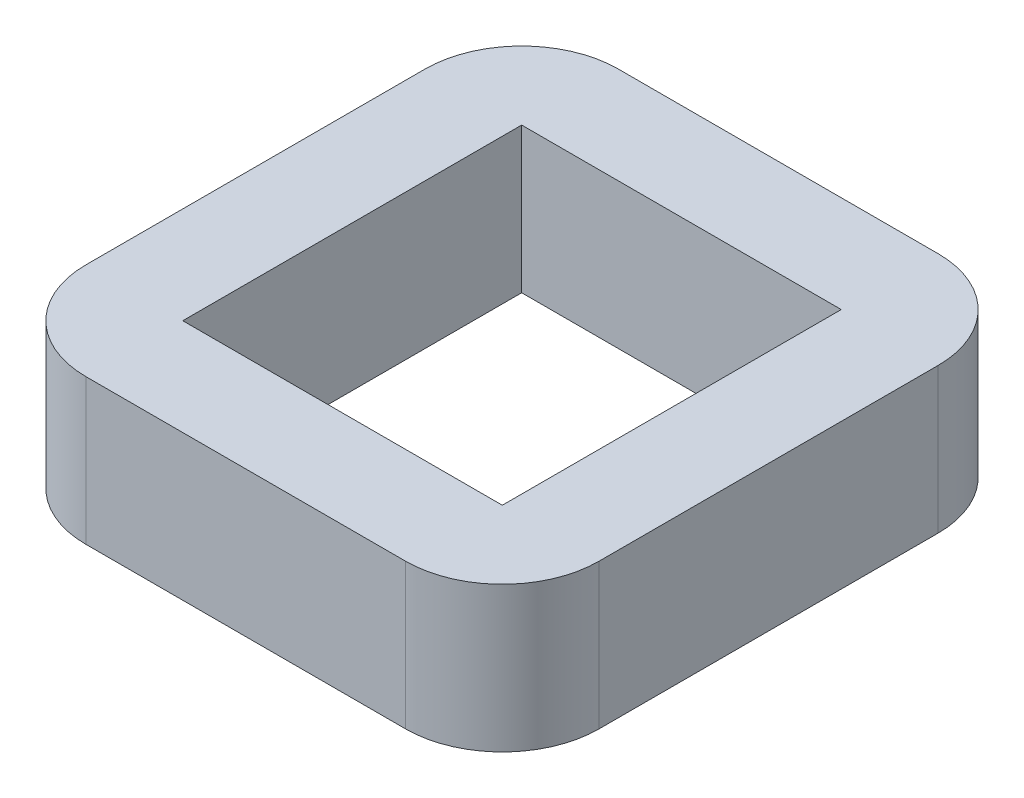
ISO-10303-21;
HEADER;
FILE_DESCRIPTION(('STEP AP214'),'2;1');
FILE_NAME('part.step','',(''),(''),'','','');
FILE_SCHEMA(('AUTOMOTIVE_DESIGN { 1 0 10303 214 1 1 1 1 }'));
ENDSEC;
DATA;
#1=APPLICATION_CONTEXT('core data for automotive mechanical design processes');
#2=APPLICATION_PROTOCOL_DEFINITION('international standard','automotive_design',2000,#1);
#3=PRODUCT_CONTEXT('',#1,'mechanical');
#4=PRODUCT('Part','Part','',(#3));
#5=PRODUCT_RELATED_PRODUCT_CATEGORY('part','',(#4));
#6=PRODUCT_DEFINITION_FORMATION('','',#4);
#7=PRODUCT_DEFINITION_CONTEXT('part definition',#1,'design');
#8=PRODUCT_DEFINITION('design','',#6,#7);
#9=PRODUCT_DEFINITION_SHAPE('','',#8);
#10=(LENGTH_UNIT() NAMED_UNIT(*) SI_UNIT(.MILLI.,.METRE.));
#11=(NAMED_UNIT(*) PLANE_ANGLE_UNIT() SI_UNIT($,.RADIAN.));
#12=(NAMED_UNIT(*) SI_UNIT($,.STERADIAN.) SOLID_ANGLE_UNIT());
#13=UNCERTAINTY_MEASURE_WITH_UNIT(LENGTH_MEASURE(1.E-05),#10,'distance_accuracy_value','');
#14=(GEOMETRIC_REPRESENTATION_CONTEXT(3) GLOBAL_UNCERTAINTY_ASSIGNED_CONTEXT((#13)) GLOBAL_UNIT_ASSIGNED_CONTEXT((#10,
#11,#12)) REPRESENTATION_CONTEXT('',''));
#15=CARTESIAN_POINT('',(0.,0.,0.));
#16=DIRECTION('',(0.,0.,1.));
#17=DIRECTION('',(1.,0.,0.));
#18=AXIS2_PLACEMENT_3D('',#15,#16,#17);
#19=CARTESIAN_POINT('',(-16.5,15.,-17.5));
#20=DIRECTION('',(0.,-1.,0.));
#21=DIRECTION('',(0.,0.,-1.));
#22=AXIS2_PLACEMENT_3D('',#19,#20,#21);
#23=PLANE('',#22);
#24=CARTESIAN_POINT('',(-16.5,15.,-17.5));
#25=DIRECTION('',(0.,1.,0.));
#26=DIRECTION('',(0.,0.,-1.));
#27=AXIS2_PLACEMENT_3D('',#24,#25,#26);
#28=CIRCLE('',#27,9.99999999999997);
#29=CARTESIAN_POINT('',(-16.5,15.,-27.5));
#30=VERTEX_POINT('',#29);
#31=CARTESIAN_POINT('',(-26.5,15.,-17.5));
#32=VERTEX_POINT('',#31);
#33=EDGE_CURVE('E157',#30,#32,#28,.T.);
#34=ORIENTED_EDGE('',*,*,#33,.T.);
#35=DIRECTION('',(0.,0.,1.));
#36=VECTOR('',#35,1.);
#37=CARTESIAN_POINT('',(-26.5,15.,17.5));
#38=LINE('',#37,#36);
#39=CARTESIAN_POINT('',(-26.5,15.,17.5));
#40=VERTEX_POINT('',#39);
#41=EDGE_CURVE('E160',#32,#40,#38,.T.);
#42=ORIENTED_EDGE('',*,*,#41,.T.);
#43=CARTESIAN_POINT('',(-16.5,15.,17.5));
#44=DIRECTION('',(0.,1.,0.));
#45=DIRECTION('',(0.,0.,1.));
#46=AXIS2_PLACEMENT_3D('',#43,#44,#45);
#47=CIRCLE('',#46,9.99999999999999);
#48=CARTESIAN_POINT('',(-16.5,15.,27.5));
#49=VERTEX_POINT('',#48);
#50=EDGE_CURVE('E163',#40,#49,#47,.T.);
#51=ORIENTED_EDGE('',*,*,#50,.T.);
#52=DIRECTION('',(1.,0.,0.));
#53=VECTOR('',#52,1.);
#54=CARTESIAN_POINT('',(16.5,15.,27.5));
#55=LINE('',#54,#53);
#56=CARTESIAN_POINT('',(16.5,15.,27.5));
#57=VERTEX_POINT('',#56);
#58=EDGE_CURVE('E165',#49,#57,#55,.T.);
#59=ORIENTED_EDGE('',*,*,#58,.T.);
#60=CARTESIAN_POINT('',(16.5,15.,17.5));
#61=DIRECTION('',(0.,1.,0.));
#62=DIRECTION('',(0.,0.,1.));
#63=AXIS2_PLACEMENT_3D('',#60,#61,#62);
#64=CIRCLE('',#63,10.);
#65=CARTESIAN_POINT('',(26.5,15.,17.5));
#66=VERTEX_POINT('',#65);
#67=EDGE_CURVE('E167',#57,#66,#64,.T.);
#68=ORIENTED_EDGE('',*,*,#67,.T.);
#69=DIRECTION('',(0.,0.,-1.));
#70=VECTOR('',#69,1.);
#71=CARTESIAN_POINT('',(26.5,15.,17.5));
#72=LINE('',#71,#70);
#73=CARTESIAN_POINT('',(26.5,15.,-17.5));
#74=VERTEX_POINT('',#73);
#75=EDGE_CURVE('E169',#66,#74,#72,.T.);
#76=ORIENTED_EDGE('',*,*,#75,.T.);
#77=CARTESIAN_POINT('',(16.5,15.,-17.5));
#78=DIRECTION('',(0.,1.,0.));
#79=DIRECTION('',(0.,0.,-1.));
#80=AXIS2_PLACEMENT_3D('',#77,#78,#79);
#81=CIRCLE('',#80,9.99999999999999);
#82=CARTESIAN_POINT('',(16.5,15.,-27.5));
#83=VERTEX_POINT('',#82);
#84=EDGE_CURVE('E171',#74,#83,#81,.T.);
#85=ORIENTED_EDGE('',*,*,#84,.T.);
#86=DIRECTION('',(-1.,0.,0.));
#87=VECTOR('',#86,1.);
#88=CARTESIAN_POINT('',(16.5,15.,-27.5));
#89=LINE('',#88,#87);
#90=EDGE_CURVE('E173',#83,#30,#89,.T.);
#91=ORIENTED_EDGE('',*,*,#90,.T.);
#92=EDGE_LOOP('',(#34,#42,#51,#59,#68,#76,#85,#91));
#93=FACE_BOUND('',#92,.T.);
#94=DIRECTION('',(0.,0.,1.));
#95=VECTOR('',#94,1.);
#96=CARTESIAN_POINT('',(-16.5,15.,17.5));
#97=LINE('',#96,#95);
#98=CARTESIAN_POINT('',(-16.5,15.,-17.5));
#99=VERTEX_POINT('',#98);
#100=CARTESIAN_POINT('',(-16.5,15.,17.5));
#101=VERTEX_POINT('',#100);
#102=EDGE_CURVE('E121',#99,#101,#97,.T.);
#103=ORIENTED_EDGE('',*,*,#102,.F.);
#104=DIRECTION('',(-1.,0.,0.));
#105=VECTOR('',#104,1.);
#106=CARTESIAN_POINT('',(16.5,15.,-17.5));
#107=LINE('',#106,#105);
#108=CARTESIAN_POINT('',(16.5,15.,-17.5));
#109=VERTEX_POINT('',#108);
#110=EDGE_CURVE('E143',#109,#99,#107,.T.);
#111=ORIENTED_EDGE('',*,*,#110,.F.);
#112=DIRECTION('',(0.,0.,-1.));
#113=VECTOR('',#112,1.);
#114=CARTESIAN_POINT('',(16.5,15.,17.5));
#115=LINE('',#114,#113);
#116=CARTESIAN_POINT('',(16.5,15.,17.5));
#117=VERTEX_POINT('',#116);
#118=EDGE_CURVE('E141',#117,#109,#115,.T.);
#119=ORIENTED_EDGE('',*,*,#118,.F.);
#120=DIRECTION('',(1.,0.,0.));
#121=VECTOR('',#120,1.);
#122=CARTESIAN_POINT('',(16.5,15.,17.5));
#123=LINE('',#122,#121);
#124=EDGE_CURVE('E129',#101,#117,#123,.T.);
#125=ORIENTED_EDGE('',*,*,#124,.F.);
#126=EDGE_LOOP('',(#103,#111,#119,#125));
#127=FACE_BOUND('',#126,.T.);
#128=ADVANCED_FACE('F32',(#93,#127),#23,.F.);
#129=CARTESIAN_POINT('',(-16.5,0.,-17.5));
#130=DIRECTION('',(0.,-1.,0.));
#131=DIRECTION('',(0.,0.,-1.));
#132=AXIS2_PLACEMENT_3D('',#129,#130,#131);
#133=PLANE('',#132);
#134=CARTESIAN_POINT('',(-16.5,0.,-17.5));
#135=DIRECTION('',(0.,1.,0.));
#136=DIRECTION('',(0.,0.,-1.));
#137=AXIS2_PLACEMENT_3D('',#134,#135,#136);
#138=CIRCLE('',#137,9.99999999999997);
#139=CARTESIAN_POINT('',(-16.5,0.,-27.5));
#140=VERTEX_POINT('',#139);
#141=CARTESIAN_POINT('',(-26.5,0.,-17.5));
#142=VERTEX_POINT('',#141);
#143=EDGE_CURVE('E137',#140,#142,#138,.T.);
#144=ORIENTED_EDGE('',*,*,#143,.F.);
#145=DIRECTION('',(-1.,0.,0.));
#146=VECTOR('',#145,1.);
#147=CARTESIAN_POINT('',(16.5,0.,-27.5));
#148=LINE('',#147,#146);
#149=CARTESIAN_POINT('',(16.5,0.,-27.5));
#150=VERTEX_POINT('',#149);
#151=EDGE_CURVE('E161',#150,#140,#148,.T.);
#152=ORIENTED_EDGE('',*,*,#151,.F.);
#153=CARTESIAN_POINT('',(16.5,0.,-17.5));
#154=DIRECTION('',(0.,1.,0.));
#155=DIRECTION('',(0.,0.,-1.));
#156=AXIS2_PLACEMENT_3D('',#153,#154,#155);
#157=CIRCLE('',#156,9.99999999999999);
#158=CARTESIAN_POINT('',(26.5,0.,-17.5));
#159=VERTEX_POINT('',#158);
#160=EDGE_CURVE('E188',#159,#150,#157,.T.);
#161=ORIENTED_EDGE('',*,*,#160,.F.);
#162=DIRECTION('',(0.,0.,-1.));
#163=VECTOR('',#162,1.);
#164=CARTESIAN_POINT('',(26.5,0.,17.5));
#165=LINE('',#164,#163);
#166=CARTESIAN_POINT('',(26.5,0.,17.5));
#167=VERTEX_POINT('',#166);
#168=EDGE_CURVE('E186',#167,#159,#165,.T.);
#169=ORIENTED_EDGE('',*,*,#168,.F.);
#170=CARTESIAN_POINT('',(16.5,0.,17.5));
#171=DIRECTION('',(0.,1.,0.));
#172=DIRECTION('',(0.,0.,1.));
#173=AXIS2_PLACEMENT_3D('',#170,#171,#172);
#174=CIRCLE('',#173,10.);
#175=CARTESIAN_POINT('',(16.5,0.,27.5));
#176=VERTEX_POINT('',#175);
#177=EDGE_CURVE('E184',#176,#167,#174,.T.);
#178=ORIENTED_EDGE('',*,*,#177,.F.);
#179=DIRECTION('',(1.,0.,0.));
#180=VECTOR('',#179,1.);
#181=CARTESIAN_POINT('',(16.5,0.,27.5));
#182=LINE('',#181,#180);
#183=CARTESIAN_POINT('',(-16.5,0.,27.5));
#184=VERTEX_POINT('',#183);
#185=EDGE_CURVE('E182',#184,#176,#182,.T.);
#186=ORIENTED_EDGE('',*,*,#185,.F.);
#187=CARTESIAN_POINT('',(-16.5,0.,17.5));
#188=DIRECTION('',(0.,1.,0.));
#189=DIRECTION('',(0.,0.,1.));
#190=AXIS2_PLACEMENT_3D('',#187,#188,#189);
#191=CIRCLE('',#190,9.99999999999999);
#192=CARTESIAN_POINT('',(-26.5,0.,17.5));
#193=VERTEX_POINT('',#192);
#194=EDGE_CURVE('E180',#193,#184,#191,.T.);
#195=ORIENTED_EDGE('',*,*,#194,.F.);
#196=DIRECTION('',(0.,0.,1.));
#197=VECTOR('',#196,1.);
#198=CARTESIAN_POINT('',(-26.5,0.,17.5));
#199=LINE('',#198,#197);
#200=EDGE_CURVE('E178',#142,#193,#199,.T.);
#201=ORIENTED_EDGE('',*,*,#200,.F.);
#202=EDGE_LOOP('',(#144,#152,#161,#169,#178,#186,#195,#201));
#203=FACE_BOUND('',#202,.T.);
#204=DIRECTION('',(-1.,0.,0.));
#205=VECTOR('',#204,1.);
#206=CARTESIAN_POINT('',(16.5,0.,-17.5));
#207=LINE('',#206,#205);
#208=CARTESIAN_POINT('',(16.5,0.,-17.5));
#209=VERTEX_POINT('',#208);
#210=CARTESIAN_POINT('',(-16.5,0.,-17.5));
#211=VERTEX_POINT('',#210);
#212=EDGE_CURVE('E130',#209,#211,#207,.T.);
#213=ORIENTED_EDGE('',*,*,#212,.T.);
#214=DIRECTION('',(0.,0.,1.));
#215=VECTOR('',#214,1.);
#216=CARTESIAN_POINT('',(-16.5,0.,17.5));
#217=LINE('',#216,#215);
#218=CARTESIAN_POINT('',(-16.5,0.,17.5));
#219=VERTEX_POINT('',#218);
#220=EDGE_CURVE('E55',#211,#219,#217,.T.);
#221=ORIENTED_EDGE('',*,*,#220,.T.);
#222=DIRECTION('',(1.,0.,0.));
#223=VECTOR('',#222,1.);
#224=CARTESIAN_POINT('',(16.5,0.,17.5));
#225=LINE('',#224,#223);
#226=CARTESIAN_POINT('',(16.5,0.,17.5));
#227=VERTEX_POINT('',#226);
#228=EDGE_CURVE('E136',#219,#227,#225,.T.);
#229=ORIENTED_EDGE('',*,*,#228,.T.);
#230=DIRECTION('',(0.,0.,-1.));
#231=VECTOR('',#230,1.);
#232=CARTESIAN_POINT('',(16.5,0.,17.5));
#233=LINE('',#232,#231);
#234=EDGE_CURVE('E149',#227,#209,#233,.T.);
#235=ORIENTED_EDGE('',*,*,#234,.T.);
#236=EDGE_LOOP('',(#213,#221,#229,#235));
#237=FACE_BOUND('',#236,.T.);
#238=ADVANCED_FACE('F218',(#203,#237),#133,.T.);
#239=CARTESIAN_POINT('',(-16.5,15.,-17.5));
#240=DIRECTION('',(0.,-1.,0.));
#241=DIRECTION('',(0.,0.,-1.));
#242=AXIS2_PLACEMENT_3D('',#239,#240,#241);
#243=CYLINDRICAL_SURFACE('',#242,9.99999999999997);
#244=ORIENTED_EDGE('',*,*,#143,.T.);
#245=DIRECTION('',(0.,-1.,0.));
#246=VECTOR('',#245,1.);
#247=CARTESIAN_POINT('',(-26.5,15.,-17.5));
#248=LINE('',#247,#246);
#249=EDGE_CURVE('E11',#32,#142,#248,.T.);
#250=ORIENTED_EDGE('',*,*,#249,.F.);
#251=ORIENTED_EDGE('',*,*,#33,.F.);
#252=DIRECTION('',(0.,-1.,0.));
#253=VECTOR('',#252,1.);
#254=CARTESIAN_POINT('',(-16.5,15.,-27.5));
#255=LINE('',#254,#253);
#256=EDGE_CURVE('E175',#30,#140,#255,.T.);
#257=ORIENTED_EDGE('',*,*,#256,.T.);
#258=EDGE_LOOP('',(#244,#250,#251,#257));
#259=FACE_BOUND('',#258,.T.);
#260=ADVANCED_FACE('F34',(#259),#243,.T.);
#261=CARTESIAN_POINT('',(-26.5,15.,17.5));
#262=DIRECTION('',(1.,0.,0.));
#263=DIRECTION('',(0.,0.,-1.));
#264=AXIS2_PLACEMENT_3D('',#261,#262,#263);
#265=PLANE('',#264);
#266=ORIENTED_EDGE('',*,*,#200,.T.);
#267=DIRECTION('',(0.,-1.,0.));
#268=VECTOR('',#267,1.);
#269=CARTESIAN_POINT('',(-26.5,15.,17.5));
#270=LINE('',#269,#268);
#271=EDGE_CURVE('E40',#40,#193,#270,.T.);
#272=ORIENTED_EDGE('',*,*,#271,.F.);
#273=ORIENTED_EDGE('',*,*,#41,.F.);
#274=ORIENTED_EDGE('',*,*,#249,.T.);
#275=EDGE_LOOP('',(#266,#272,#273,#274));
#276=FACE_BOUND('',#275,.T.);
#277=ADVANCED_FACE('F235',(#276),#265,.F.);
#278=CARTESIAN_POINT('',(-16.5,15.,17.5));
#279=DIRECTION('',(0.,-1.,0.));
#280=DIRECTION('',(0.,0.,-1.));
#281=AXIS2_PLACEMENT_3D('',#278,#279,#280);
#282=CYLINDRICAL_SURFACE('',#281,9.99999999999999);
#283=ORIENTED_EDGE('',*,*,#194,.T.);
#284=DIRECTION('',(0.,-1.,0.));
#285=VECTOR('',#284,1.);
#286=CARTESIAN_POINT('',(-16.5,15.,27.5));
#287=LINE('',#286,#285);
#288=EDGE_CURVE('E205',#49,#184,#287,.T.);
#289=ORIENTED_EDGE('',*,*,#288,.F.);
#290=ORIENTED_EDGE('',*,*,#50,.F.);
#291=ORIENTED_EDGE('',*,*,#271,.T.);
#292=EDGE_LOOP('',(#283,#289,#290,#291));
#293=FACE_BOUND('',#292,.T.);
#294=ADVANCED_FACE('F212',(#293),#282,.T.);
#295=CARTESIAN_POINT('',(16.5,15.,27.5));
#296=DIRECTION('',(0.,0.,-1.));
#297=DIRECTION('',(-1.,0.,0.));
#298=AXIS2_PLACEMENT_3D('',#295,#296,#297);
#299=PLANE('',#298);
#300=ORIENTED_EDGE('',*,*,#185,.T.);
#301=DIRECTION('',(0.,-1.,0.));
#302=VECTOR('',#301,1.);
#303=CARTESIAN_POINT('',(16.5,15.,27.5));
#304=LINE('',#303,#302);
#305=EDGE_CURVE('E202',#57,#176,#304,.T.);
#306=ORIENTED_EDGE('',*,*,#305,.F.);
#307=ORIENTED_EDGE('',*,*,#58,.F.);
#308=ORIENTED_EDGE('',*,*,#288,.T.);
#309=EDGE_LOOP('',(#300,#306,#307,#308));
#310=FACE_BOUND('',#309,.T.);
#311=ADVANCED_FACE('F224',(#310),#299,.F.);
#312=CARTESIAN_POINT('',(16.5,15.,17.5));
#313=DIRECTION('',(0.,-1.,0.));
#314=DIRECTION('',(0.,0.,-1.));
#315=AXIS2_PLACEMENT_3D('',#312,#313,#314);
#316=CYLINDRICAL_SURFACE('',#315,10.);
#317=ORIENTED_EDGE('',*,*,#177,.T.);
#318=DIRECTION('',(0.,-1.,0.));
#319=VECTOR('',#318,1.);
#320=CARTESIAN_POINT('',(26.5,15.,17.5));
#321=LINE('',#320,#319);
#322=EDGE_CURVE('E199',#66,#167,#321,.T.);
#323=ORIENTED_EDGE('',*,*,#322,.F.);
#324=ORIENTED_EDGE('',*,*,#67,.F.);
#325=ORIENTED_EDGE('',*,*,#305,.T.);
#326=EDGE_LOOP('',(#317,#323,#324,#325));
#327=FACE_BOUND('',#326,.T.);
#328=ADVANCED_FACE('F228',(#327),#316,.T.);
#329=CARTESIAN_POINT('',(26.5,15.,17.5));
#330=DIRECTION('',(-1.,0.,0.));
#331=DIRECTION('',(0.,0.,1.));
#332=AXIS2_PLACEMENT_3D('',#329,#330,#331);
#333=PLANE('',#332);
#334=ORIENTED_EDGE('',*,*,#168,.T.);
#335=DIRECTION('',(0.,-1.,0.));
#336=VECTOR('',#335,1.);
#337=CARTESIAN_POINT('',(26.5,15.,-17.5));
#338=LINE('',#337,#336);
#339=EDGE_CURVE('E196',#74,#159,#338,.T.);
#340=ORIENTED_EDGE('',*,*,#339,.F.);
#341=ORIENTED_EDGE('',*,*,#75,.F.);
#342=ORIENTED_EDGE('',*,*,#322,.T.);
#343=EDGE_LOOP('',(#334,#340,#341,#342));
#344=FACE_BOUND('',#343,.T.);
#345=ADVANCED_FACE('F248',(#344),#333,.F.);
#346=CARTESIAN_POINT('',(16.5,15.,-17.5));
#347=DIRECTION('',(0.,-1.,0.));
#348=DIRECTION('',(0.,0.,-1.));
#349=AXIS2_PLACEMENT_3D('',#346,#347,#348);
#350=CYLINDRICAL_SURFACE('',#349,9.99999999999999);
#351=ORIENTED_EDGE('',*,*,#160,.T.);
#352=DIRECTION('',(0.,-1.,0.));
#353=VECTOR('',#352,1.);
#354=CARTESIAN_POINT('',(16.5,15.,-27.5));
#355=LINE('',#354,#353);
#356=EDGE_CURVE('E193',#83,#150,#355,.T.);
#357=ORIENTED_EDGE('',*,*,#356,.F.);
#358=ORIENTED_EDGE('',*,*,#84,.F.);
#359=ORIENTED_EDGE('',*,*,#339,.T.);
#360=EDGE_LOOP('',(#351,#357,#358,#359));
#361=FACE_BOUND('',#360,.T.);
#362=ADVANCED_FACE('F246',(#361),#350,.T.);
#363=CARTESIAN_POINT('',(16.5,15.,-27.5));
#364=DIRECTION('',(0.,0.,1.));
#365=DIRECTION('',(1.,0.,0.));
#366=AXIS2_PLACEMENT_3D('',#363,#364,#365);
#367=PLANE('',#366);
#368=ORIENTED_EDGE('',*,*,#151,.T.);
#369=ORIENTED_EDGE('',*,*,#256,.F.);
#370=ORIENTED_EDGE('',*,*,#90,.F.);
#371=ORIENTED_EDGE('',*,*,#356,.T.);
#372=EDGE_LOOP('',(#368,#369,#370,#371));
#373=FACE_BOUND('',#372,.T.);
#374=ADVANCED_FACE('F241',(#373),#367,.F.);
#375=CARTESIAN_POINT('',(-16.5,15.,17.5));
#376=DIRECTION('',(1.,0.,0.));
#377=DIRECTION('',(0.,0.,-1.));
#378=AXIS2_PLACEMENT_3D('',#375,#376,#377);
#379=PLANE('',#378);
#380=ORIENTED_EDGE('',*,*,#220,.F.);
#381=DIRECTION('',(0.,-1.,0.));
#382=VECTOR('',#381,1.);
#383=CARTESIAN_POINT('',(-16.5,15.,-17.5));
#384=LINE('',#383,#382);
#385=EDGE_CURVE('E125',#99,#211,#384,.T.);
#386=ORIENTED_EDGE('',*,*,#385,.F.);
#387=ORIENTED_EDGE('',*,*,#102,.T.);
#388=DIRECTION('',(0.,-1.,0.));
#389=VECTOR('',#388,1.);
#390=CARTESIAN_POINT('',(-16.5,15.,17.5));
#391=LINE('',#390,#389);
#392=EDGE_CURVE('E124',#101,#219,#391,.T.);
#393=ORIENTED_EDGE('',*,*,#392,.T.);
#394=EDGE_LOOP('',(#380,#386,#387,#393));
#395=FACE_BOUND('',#394,.T.);
#396=ADVANCED_FACE('F123',(#395),#379,.T.);
#397=CARTESIAN_POINT('',(16.5,15.,17.5));
#398=DIRECTION('',(0.,0.,-1.));
#399=DIRECTION('',(-1.,0.,0.));
#400=AXIS2_PLACEMENT_3D('',#397,#398,#399);
#401=PLANE('',#400);
#402=ORIENTED_EDGE('',*,*,#228,.F.);
#403=ORIENTED_EDGE('',*,*,#392,.F.);
#404=ORIENTED_EDGE('',*,*,#124,.T.);
#405=DIRECTION('',(0.,-1.,0.));
#406=VECTOR('',#405,1.);
#407=CARTESIAN_POINT('',(16.5,15.,17.5));
#408=LINE('',#407,#406);
#409=EDGE_CURVE('E138',#117,#227,#408,.T.);
#410=ORIENTED_EDGE('',*,*,#409,.T.);
#411=EDGE_LOOP('',(#402,#403,#404,#410));
#412=FACE_BOUND('',#411,.T.);
#413=ADVANCED_FACE('F133',(#412),#401,.T.);
#414=CARTESIAN_POINT('',(16.5,15.,17.5));
#415=DIRECTION('',(-1.,0.,0.));
#416=DIRECTION('',(0.,0.,1.));
#417=AXIS2_PLACEMENT_3D('',#414,#415,#416);
#418=PLANE('',#417);
#419=ORIENTED_EDGE('',*,*,#234,.F.);
#420=ORIENTED_EDGE('',*,*,#409,.F.);
#421=ORIENTED_EDGE('',*,*,#118,.T.);
#422=DIRECTION('',(0.,-1.,0.));
#423=VECTOR('',#422,1.);
#424=CARTESIAN_POINT('',(16.5,15.,-17.5));
#425=LINE('',#424,#423);
#426=EDGE_CURVE('E47',#109,#209,#425,.T.);
#427=ORIENTED_EDGE('',*,*,#426,.T.);
#428=EDGE_LOOP('',(#419,#420,#421,#427));
#429=FACE_BOUND('',#428,.T.);
#430=ADVANCED_FACE('F273',(#429),#418,.T.);
#431=CARTESIAN_POINT('',(16.5,15.,-17.5));
#432=DIRECTION('',(0.,0.,1.));
#433=DIRECTION('',(1.,0.,0.));
#434=AXIS2_PLACEMENT_3D('',#431,#432,#433);
#435=PLANE('',#434);
#436=ORIENTED_EDGE('',*,*,#212,.F.);
#437=ORIENTED_EDGE('',*,*,#426,.F.);
#438=ORIENTED_EDGE('',*,*,#110,.T.);
#439=ORIENTED_EDGE('',*,*,#385,.T.);
#440=EDGE_LOOP('',(#436,#437,#438,#439));
#441=FACE_BOUND('',#440,.T.);
#442=ADVANCED_FACE('F277',(#441),#435,.T.);
#443=CLOSED_SHELL('',(#128,#238,#260,#277,#294,#311,#328,#345,#362,#374,#396,#413,#430,#442));
#444=MANIFOLD_SOLID_BREP('B2',#443);
#445=ADVANCED_BREP_SHAPE_REPRESENTATION('',(#18,#444),#14);
#446=SHAPE_DEFINITION_REPRESENTATION(#9,#445);
ENDSEC;
END-ISO-10303-21;
